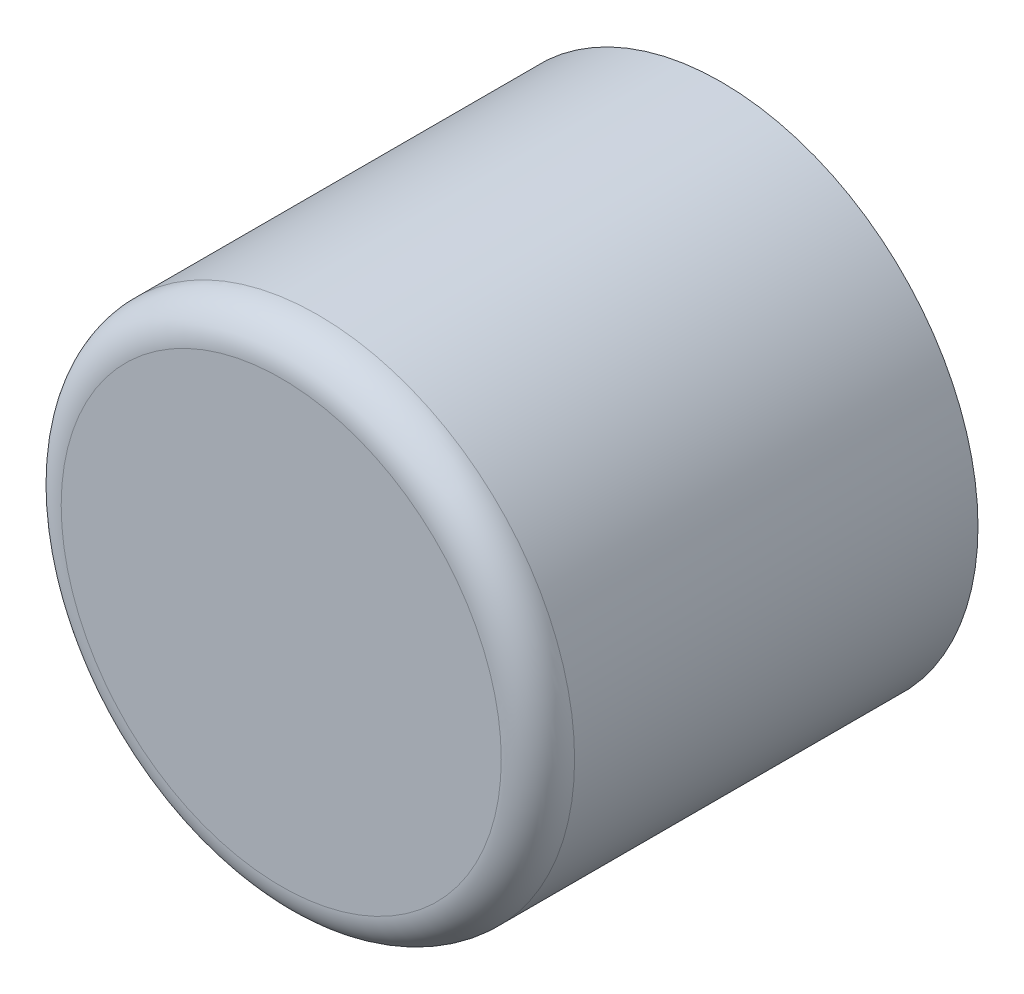
ISO-10303-21;
HEADER;
FILE_DESCRIPTION(('STEP AP214'),'2;1');
FILE_NAME('part.step','',(''),(''),'','','');
FILE_SCHEMA(('AUTOMOTIVE_DESIGN { 1 0 10303 214 1 1 1 1 }'));
ENDSEC;
DATA;
#1=APPLICATION_CONTEXT('core data for automotive mechanical design processes');
#2=APPLICATION_PROTOCOL_DEFINITION('international standard','automotive_design',2000,#1);
#3=PRODUCT_CONTEXT('',#1,'mechanical');
#4=PRODUCT('Part','Part','',(#3));
#5=PRODUCT_RELATED_PRODUCT_CATEGORY('part','',(#4));
#6=PRODUCT_DEFINITION_FORMATION('','',#4);
#7=PRODUCT_DEFINITION_CONTEXT('part definition',#1,'design');
#8=PRODUCT_DEFINITION('design','',#6,#7);
#9=PRODUCT_DEFINITION_SHAPE('','',#8);
#10=(LENGTH_UNIT() NAMED_UNIT(*) SI_UNIT(.MILLI.,.METRE.));
#11=(NAMED_UNIT(*) PLANE_ANGLE_UNIT() SI_UNIT($,.RADIAN.));
#12=(NAMED_UNIT(*) SI_UNIT($,.STERADIAN.) SOLID_ANGLE_UNIT());
#13=UNCERTAINTY_MEASURE_WITH_UNIT(LENGTH_MEASURE(1.E-05),#10,'distance_accuracy_value','');
#14=(GEOMETRIC_REPRESENTATION_CONTEXT(3) GLOBAL_UNCERTAINTY_ASSIGNED_CONTEXT((#13)) GLOBAL_UNIT_ASSIGNED_CONTEXT((#10,
#11,#12)) REPRESENTATION_CONTEXT('',''));
#15=CARTESIAN_POINT('',(0.,0.,0.));
#16=DIRECTION('',(0.,0.,1.));
#17=DIRECTION('',(1.,0.,0.));
#18=AXIS2_PLACEMENT_3D('',#15,#16,#17);
#19=CARTESIAN_POINT('',(0.,0.,180.));
#20=DIRECTION('',(0.,0.,-1.));
#21=DIRECTION('',(-1.,0.,0.));
#22=AXIS2_PLACEMENT_3D('',#19,#20,#21);
#23=CYLINDRICAL_SURFACE('',#22,95.);
#24=CARTESIAN_POINT('',(0.,0.,0.));
#25=DIRECTION('',(0.,0.,1.));
#26=DIRECTION('',(1.,0.,0.));
#27=AXIS2_PLACEMENT_3D('',#24,#25,#26);
#28=CIRCLE('',#27,95.);
#29=CARTESIAN_POINT('',(-95.,0.,0.));
#30=VERTEX_POINT('',#29);
#31=EDGE_CURVE('E46',#30,#30,#28,.T.);
#32=CARTESIAN_POINT('',(0.,0.,160.));
#33=DIRECTION('',(0.,0.,1.));
#34=DIRECTION('',(1.,0.,0.));
#35=AXIS2_PLACEMENT_3D('',#32,#33,#34);
#36=CIRCLE('',#35,95.);
#37=CARTESIAN_POINT('',(-95.,0.,160.));
#38=VERTEX_POINT('',#37);
#39=EDGE_CURVE('E49',#38,#38,#36,.T.);
#40=CARTESIAN_POINT('',(-95.,0.,0.));
#41=CARTESIAN_POINT('',(-95.,0.,1.66666666666664));
#42=CARTESIAN_POINT('',(-95.,0.,3.33333333333331));
#43=CARTESIAN_POINT('',(-95.,0.,6.66666666666664));
#44=CARTESIAN_POINT('',(-95.,0.,8.33333333333331));
#45=CARTESIAN_POINT('',(-95.,0.,11.6666666666666));
#46=CARTESIAN_POINT('',(-95.,0.,13.3333333333333));
#47=CARTESIAN_POINT('',(-95.,0.,16.6666666666667));
#48=CARTESIAN_POINT('',(-95.,0.,18.3333333333333));
#49=CARTESIAN_POINT('',(-95.,0.,21.6666666666667));
#50=CARTESIAN_POINT('',(-95.,0.,23.3333333333333));
#51=CARTESIAN_POINT('',(-95.,0.,26.6666666666666));
#52=CARTESIAN_POINT('',(-95.,0.,28.3333333333333));
#53=CARTESIAN_POINT('',(-95.,0.,31.6666666666666));
#54=CARTESIAN_POINT('',(-95.,0.,33.3333333333333));
#55=CARTESIAN_POINT('',(-95.,0.,36.6666666666666));
#56=CARTESIAN_POINT('',(-95.,0.,38.3333333333333));
#57=CARTESIAN_POINT('',(-95.,0.,41.6666666666667));
#58=CARTESIAN_POINT('',(-95.,0.,43.3333333333333));
#59=CARTESIAN_POINT('',(-95.,0.,46.6666666666667));
#60=CARTESIAN_POINT('',(-95.,0.,48.3333333333333));
#61=CARTESIAN_POINT('',(-95.,0.,51.6666666666666));
#62=CARTESIAN_POINT('',(-95.,0.,53.3333333333333));
#63=CARTESIAN_POINT('',(-95.,0.,56.6666666666666));
#64=CARTESIAN_POINT('',(-95.,0.,58.3333333333333));
#65=CARTESIAN_POINT('',(-95.,0.,61.6666666666666));
#66=CARTESIAN_POINT('',(-95.,0.,63.3333333333333));
#67=CARTESIAN_POINT('',(-95.,0.,66.6666666666666));
#68=CARTESIAN_POINT('',(-95.,0.,68.3333333333333));
#69=CARTESIAN_POINT('',(-95.,0.,71.6666666666666));
#70=CARTESIAN_POINT('',(-95.,0.,73.3333333333333));
#71=CARTESIAN_POINT('',(-95.,0.,76.6666666666666));
#72=CARTESIAN_POINT('',(-95.,0.,78.3333333333333));
#73=CARTESIAN_POINT('',(-95.,0.,81.6666666666666));
#74=CARTESIAN_POINT('',(-95.,0.,83.3333333333333));
#75=CARTESIAN_POINT('',(-95.,0.,86.6666666666666));
#76=CARTESIAN_POINT('',(-95.,0.,88.3333333333333));
#77=CARTESIAN_POINT('',(-95.,0.,91.6666666666666));
#78=CARTESIAN_POINT('',(-95.,0.,93.3333333333333));
#79=CARTESIAN_POINT('',(-95.,0.,96.6666666666666));
#80=CARTESIAN_POINT('',(-95.,0.,98.3333333333333));
#81=CARTESIAN_POINT('',(-95.,0.,101.666666666667));
#82=CARTESIAN_POINT('',(-95.,0.,103.333333333333));
#83=CARTESIAN_POINT('',(-95.,0.,106.666666666667));
#84=CARTESIAN_POINT('',(-95.,0.,108.333333333333));
#85=CARTESIAN_POINT('',(-95.,0.,111.666666666667));
#86=CARTESIAN_POINT('',(-95.,0.,113.333333333333));
#87=CARTESIAN_POINT('',(-95.,0.,116.666666666667));
#88=CARTESIAN_POINT('',(-95.,0.,118.333333333333));
#89=CARTESIAN_POINT('',(-95.,0.,121.666666666667));
#90=CARTESIAN_POINT('',(-95.,0.,123.333333333333));
#91=CARTESIAN_POINT('',(-95.,0.,126.666666666667));
#92=CARTESIAN_POINT('',(-95.,0.,128.333333333333));
#93=CARTESIAN_POINT('',(-95.,0.,131.666666666667));
#94=CARTESIAN_POINT('',(-95.,0.,133.333333333333));
#95=CARTESIAN_POINT('',(-95.,0.,136.666666666667));
#96=CARTESIAN_POINT('',(-95.,0.,138.333333333333));
#97=CARTESIAN_POINT('',(-95.,0.,141.666666666667));
#98=CARTESIAN_POINT('',(-95.,0.,143.333333333333));
#99=CARTESIAN_POINT('',(-95.,0.,146.666666666667));
#100=CARTESIAN_POINT('',(-95.,0.,148.333333333333));
#101=CARTESIAN_POINT('',(-95.,0.,151.666666666667));
#102=CARTESIAN_POINT('',(-95.,0.,153.333333333333));
#103=CARTESIAN_POINT('',(-95.,0.,156.666666666667));
#104=CARTESIAN_POINT('',(-95.,0.,158.333333333333));
#105=CARTESIAN_POINT('',(-95.,0.,160.));
#106=B_SPLINE_CURVE_WITH_KNOTS('',3,(#40,#41,#42,#43,#44,#45,#46,#47,#48,#49,#50,#51,#52,#53,
#54,#55,#56,#57,#58,#59,#60,#61,#62,#63,#64,#65,#66,#67,#68,#69,#70,#71,#72,#73,#74,#75,#76,#77,
#78,#79,#80,#81,#82,#83,#84,#85,#86,#87,#88,#89,#90,#91,#92,#93,#94,#95,#96,#97,#98,#99,#100,
#101,#102,#103,#104,#105),.UNSPECIFIED.,.F.,.F.,(4,2,2,2,2,2,2,2,2,2,2,2,2,2,2,2,2,2,2,2,2,2,2,
2,2,2,2,2,2,2,2,2,4),(0.,5.,10.,15.,20.,25.,30.,35.,40.,45.,50.,55.,60.,65.,70.,75.,80.,85.,90.,
95.,100.,105.,110.,115.,120.,125.,130.,135.,140.,145.,150.,155.,160.),.UNSPECIFIED.);
#107=EDGE_CURVE('BSEAM31',#30,#38,#106,.T.);
#108=ORIENTED_EDGE('',*,*,#31,.F.);
#109=ORIENTED_EDGE('',*,*,#39,.T.);
#110=ORIENTED_EDGE('',*,*,#107,.T.);
#111=ORIENTED_EDGE('',*,*,#107,.F.);
#112=EDGE_LOOP('',(#108,#110,#109,#111));
#113=FACE_BOUND('',#112,.T.);
#114=ADVANCED_FACE('F31',(#113),#23,.F.);
#115=CARTESIAN_POINT('',(0.,0.,180.));
#116=DIRECTION('',(0.,0.,1.));
#117=DIRECTION('',(1.,0.,0.));
#118=AXIS2_PLACEMENT_3D('',#115,#116,#117);
#119=PLANE('',#118);
#120=CARTESIAN_POINT('',(0.,0.,180.));
#121=DIRECTION('',(0.,0.,1.));
#122=DIRECTION('',(1.,0.,0.));
#123=AXIS2_PLACEMENT_3D('',#120,#121,#122);
#124=CIRCLE('',#123,90.);
#125=CARTESIAN_POINT('',(90.,0.,180.));
#126=VERTEX_POINT('',#125);
#127=EDGE_CURVE('E38',#126,#126,#124,.T.);
#128=ORIENTED_EDGE('',*,*,#127,.T.);
#129=EDGE_LOOP('',(#128));
#130=FACE_BOUND('',#129,.T.);
#131=ADVANCED_FACE('F59',(#130),#119,.T.);
#132=CARTESIAN_POINT('',(0.,0.,0.));
#133=DIRECTION('',(0.,0.,1.));
#134=DIRECTION('',(1.,0.,0.));
#135=AXIS2_PLACEMENT_3D('',#132,#133,#134);
#136=PLANE('',#135);
#137=CARTESIAN_POINT('',(0.,0.,0.));
#138=DIRECTION('',(0.,0.,1.));
#139=DIRECTION('',(1.,0.,0.));
#140=AXIS2_PLACEMENT_3D('',#137,#138,#139);
#141=CIRCLE('',#140,105.);
#142=CARTESIAN_POINT('',(-105.,0.,0.));
#143=VERTEX_POINT('',#142);
#144=EDGE_CURVE('E42',#143,#143,#141,.T.);
#145=ORIENTED_EDGE('',*,*,#144,.F.);
#146=EDGE_LOOP('',(#145));
#147=FACE_BOUND('',#146,.T.);
#148=ORIENTED_EDGE('',*,*,#31,.T.);
#149=EDGE_LOOP('',(#148));
#150=FACE_BOUND('',#149,.T.);
#151=ADVANCED_FACE('F55',(#147,#150),#136,.F.);
#152=CARTESIAN_POINT('',(0.,0.,180.));
#153=DIRECTION('',(0.,0.,-1.));
#154=DIRECTION('',(-1.,0.,0.));
#155=AXIS2_PLACEMENT_3D('',#152,#153,#154);
#156=CYLINDRICAL_SURFACE('',#155,105.);
#157=CARTESIAN_POINT('',(0.,0.,165.));
#158=DIRECTION('',(0.,0.,1.));
#159=DIRECTION('',(1.,0.,0.));
#160=AXIS2_PLACEMENT_3D('',#157,#158,#159);
#161=CIRCLE('',#160,105.);
#162=CARTESIAN_POINT('',(-105.,0.,165.));
#163=VERTEX_POINT('',#162);
#164=EDGE_CURVE('E10',#163,#163,#161,.F.);
#165=CARTESIAN_POINT('',(-105.,0.,165.));
#166=CARTESIAN_POINT('',(-105.,0.,163.28125));
#167=CARTESIAN_POINT('',(-105.,0.,161.5625));
#168=CARTESIAN_POINT('',(-105.,0.,158.125));
#169=CARTESIAN_POINT('',(-105.,0.,156.40625));
#170=CARTESIAN_POINT('',(-105.,0.,152.96875));
#171=CARTESIAN_POINT('',(-105.,0.,151.25));
#172=CARTESIAN_POINT('',(-105.,0.,147.8125));
#173=CARTESIAN_POINT('',(-105.,0.,146.09375));
#174=CARTESIAN_POINT('',(-105.,0.,142.65625));
#175=CARTESIAN_POINT('',(-105.,0.,140.9375));
#176=CARTESIAN_POINT('',(-105.,0.,137.5));
#177=CARTESIAN_POINT('',(-105.,0.,135.78125));
#178=CARTESIAN_POINT('',(-105.,0.,132.34375));
#179=CARTESIAN_POINT('',(-105.,0.,130.625));
#180=CARTESIAN_POINT('',(-105.,0.,127.1875));
#181=CARTESIAN_POINT('',(-105.,0.,125.46875));
#182=CARTESIAN_POINT('',(-105.,0.,122.03125));
#183=CARTESIAN_POINT('',(-105.,0.,120.3125));
#184=CARTESIAN_POINT('',(-105.,0.,116.875));
#185=CARTESIAN_POINT('',(-105.,0.,115.15625));
#186=CARTESIAN_POINT('',(-105.,0.,111.71875));
#187=CARTESIAN_POINT('',(-105.,0.,110.));
#188=CARTESIAN_POINT('',(-105.,0.,106.5625));
#189=CARTESIAN_POINT('',(-105.,0.,104.84375));
#190=CARTESIAN_POINT('',(-105.,0.,101.40625));
#191=CARTESIAN_POINT('',(-105.,0.,99.6875));
#192=CARTESIAN_POINT('',(-105.,0.,96.25));
#193=CARTESIAN_POINT('',(-105.,0.,94.53125));
#194=CARTESIAN_POINT('',(-105.,0.,91.09375));
#195=CARTESIAN_POINT('',(-105.,0.,89.375));
#196=CARTESIAN_POINT('',(-105.,0.,85.9375));
#197=CARTESIAN_POINT('',(-105.,0.,84.21875));
#198=CARTESIAN_POINT('',(-105.,0.,80.78125));
#199=CARTESIAN_POINT('',(-105.,0.,79.0625));
#200=CARTESIAN_POINT('',(-105.,0.,75.625));
#201=CARTESIAN_POINT('',(-105.,0.,73.90625));
#202=CARTESIAN_POINT('',(-105.,0.,70.46875));
#203=CARTESIAN_POINT('',(-105.,0.,68.75));
#204=CARTESIAN_POINT('',(-105.,0.,65.3125));
#205=CARTESIAN_POINT('',(-105.,0.,63.59375));
#206=CARTESIAN_POINT('',(-105.,0.,60.15625));
#207=CARTESIAN_POINT('',(-105.,0.,58.4375));
#208=CARTESIAN_POINT('',(-105.,0.,55.));
#209=CARTESIAN_POINT('',(-105.,0.,53.28125));
#210=CARTESIAN_POINT('',(-105.,0.,49.84375));
#211=CARTESIAN_POINT('',(-105.,0.,48.125));
#212=CARTESIAN_POINT('',(-105.,0.,44.6875));
#213=CARTESIAN_POINT('',(-105.,0.,42.96875));
#214=CARTESIAN_POINT('',(-105.,0.,39.53125));
#215=CARTESIAN_POINT('',(-105.,0.,37.8125));
#216=CARTESIAN_POINT('',(-105.,0.,34.375));
#217=CARTESIAN_POINT('',(-105.,0.,32.65625));
#218=CARTESIAN_POINT('',(-105.,0.,29.21875));
#219=CARTESIAN_POINT('',(-105.,0.,27.5));
#220=CARTESIAN_POINT('',(-105.,0.,24.0625));
#221=CARTESIAN_POINT('',(-105.,0.,22.34375));
#222=CARTESIAN_POINT('',(-105.,0.,18.90625));
#223=CARTESIAN_POINT('',(-105.,0.,17.1875));
#224=CARTESIAN_POINT('',(-105.,0.,13.75));
#225=CARTESIAN_POINT('',(-105.,0.,12.03125));
#226=CARTESIAN_POINT('',(-105.,0.,8.59374999999998));
#227=CARTESIAN_POINT('',(-105.,0.,6.87499999999997));
#228=CARTESIAN_POINT('',(-105.,0.,3.43749999999997));
#229=CARTESIAN_POINT('',(-105.,0.,1.71874999999997));
#230=CARTESIAN_POINT('',(-105.,0.,0.));
#231=B_SPLINE_CURVE_WITH_KNOTS('',3,(#165,#166,#167,#168,#169,#170,#171,#172,#173,#174,#175,
#176,#177,#178,#179,#180,#181,#182,#183,#184,#185,#186,#187,#188,#189,#190,#191,#192,#193,#194,
#195,#196,#197,#198,#199,#200,#201,#202,#203,#204,#205,#206,#207,#208,#209,#210,#211,#212,#213,
#214,#215,#216,#217,#218,#219,#220,#221,#222,#223,#224,#225,#226,#227,#228,#229,#230),
.UNSPECIFIED.,.F.,.F.,(4,2,2,2,2,2,2,2,2,2,2,2,2,2,2,2,2,2,2,2,2,2,2,2,2,2,2,2,2,2,2,2,4),(0.,
5.15625,10.3125,15.46875,20.625,25.78125,30.9375,36.09375,41.25,46.40625,51.5625,56.71875,
61.875,67.03125,72.1875,77.34375,82.5,87.65625,92.8125,97.96875,103.125,108.28125,113.4375,
118.59375,123.75,128.90625,134.0625,139.21875,144.375,149.53125,154.6875,159.84375,165.),.UNSPECIFIED.);
#232=EDGE_CURVE('BSEAM65',#163,#143,#231,.T.);
#233=ORIENTED_EDGE('',*,*,#164,.T.);
#234=ORIENTED_EDGE('',*,*,#144,.T.);
#235=ORIENTED_EDGE('',*,*,#232,.T.);
#236=ORIENTED_EDGE('',*,*,#232,.F.);
#237=EDGE_LOOP('',(#233,#235,#234,#236));
#238=FACE_BOUND('',#237,.T.);
#239=ADVANCED_FACE('F65',(#238),#156,.T.);
#240=CARTESIAN_POINT('',(0.,0.,160.));
#241=DIRECTION('',(0.,0.,1.));
#242=DIRECTION('',(1.,0.,0.));
#243=AXIS2_PLACEMENT_3D('',#240,#241,#242);
#244=PLANE('',#243);
#245=ORIENTED_EDGE('',*,*,#39,.F.);
#246=EDGE_LOOP('',(#245));
#247=FACE_BOUND('',#246,.T.);
#248=ADVANCED_FACE('F63',(#247),#244,.F.);
#249=CARTESIAN_POINT('',(0.,0.,165.));
#250=DIRECTION('',(0.,0.,1.));
#251=DIRECTION('',(1.,0.,0.));
#252=AXIS2_PLACEMENT_3D('',#249,#250,#251);
#253=TOROIDAL_SURFACE('',#252,90.,15.);
#254=ORIENTED_EDGE('',*,*,#164,.F.);
#255=EDGE_LOOP('',(#254));
#256=FACE_BOUND('',#255,.T.);
#257=ORIENTED_EDGE('',*,*,#127,.F.);
#258=EDGE_LOOP('',(#257));
#259=FACE_BOUND('',#258,.T.);
#260=ADVANCED_FACE('F33',(#256,#259),#253,.T.);
#261=CLOSED_SHELL('',(#114,#131,#151,#239,#248,#260));
#262=MANIFOLD_SOLID_BREP('B2',#261);
#263=ADVANCED_BREP_SHAPE_REPRESENTATION('',(#18,#262),#14);
#264=SHAPE_DEFINITION_REPRESENTATION(#9,#263);
ENDSEC;
END-ISO-10303-21;
